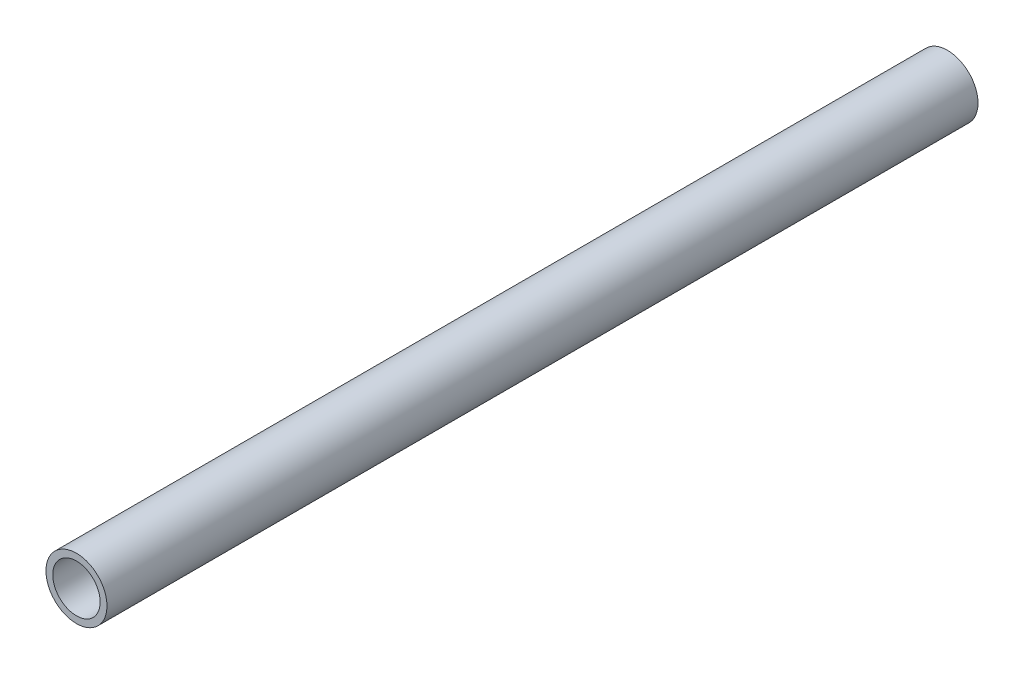
ISO-10303-21;
HEADER;
FILE_DESCRIPTION(('STEP AP214'),'2;1');
FILE_NAME('part.step','',(''),(''),'','','');
FILE_SCHEMA(('AUTOMOTIVE_DESIGN { 1 0 10303 214 1 1 1 1 }'));
ENDSEC;
DATA;
#1=APPLICATION_CONTEXT('core data for automotive mechanical design processes');
#2=APPLICATION_PROTOCOL_DEFINITION('international standard','automotive_design',2000,#1);
#3=PRODUCT_CONTEXT('',#1,'mechanical');
#4=PRODUCT('Part','Part','',(#3));
#5=PRODUCT_RELATED_PRODUCT_CATEGORY('part','',(#4));
#6=PRODUCT_DEFINITION_FORMATION('','',#4);
#7=PRODUCT_DEFINITION_CONTEXT('part definition',#1,'design');
#8=PRODUCT_DEFINITION('design','',#6,#7);
#9=PRODUCT_DEFINITION_SHAPE('','',#8);
#10=(LENGTH_UNIT() NAMED_UNIT(*) SI_UNIT(.MILLI.,.METRE.));
#11=(NAMED_UNIT(*) PLANE_ANGLE_UNIT() SI_UNIT($,.RADIAN.));
#12=(NAMED_UNIT(*) SI_UNIT($,.STERADIAN.) SOLID_ANGLE_UNIT());
#13=UNCERTAINTY_MEASURE_WITH_UNIT(LENGTH_MEASURE(1.E-05),#10,'distance_accuracy_value','');
#14=(GEOMETRIC_REPRESENTATION_CONTEXT(3) GLOBAL_UNCERTAINTY_ASSIGNED_CONTEXT((#13)) GLOBAL_UNIT_ASSIGNED_CONTEXT((#10,
#11,#12)) REPRESENTATION_CONTEXT('',''));
#15=CARTESIAN_POINT('',(0.,0.,0.));
#16=DIRECTION('',(0.,0.,1.));
#17=DIRECTION('',(1.,0.,0.));
#18=AXIS2_PLACEMENT_3D('',#15,#16,#17);
#19=CARTESIAN_POINT('',(0.,0.,257.));
#20=DIRECTION('',(0.,0.,1.));
#21=DIRECTION('',(1.,0.,0.));
#22=AXIS2_PLACEMENT_3D('',#19,#20,#21);
#23=PLANE('',#22);
#24=CARTESIAN_POINT('',(0.,0.,257.));
#25=DIRECTION('',(0.,0.,1.));
#26=DIRECTION('',(1.,0.,0.));
#27=AXIS2_PLACEMENT_3D('',#24,#25,#26);
#28=CIRCLE('',#27,9.);
#29=CARTESIAN_POINT('',(9.,0.,257.));
#30=VERTEX_POINT('',#29);
#31=EDGE_CURVE('E10',#30,#30,#28,.T.);
#32=ORIENTED_EDGE('',*,*,#31,.T.);
#33=EDGE_LOOP('',(#32));
#34=FACE_BOUND('',#33,.T.);
#35=CARTESIAN_POINT('',(0.,0.,257.));
#36=DIRECTION('',(0.,0.,1.));
#37=DIRECTION('',(1.,0.,0.));
#38=AXIS2_PLACEMENT_3D('',#35,#36,#37);
#39=CIRCLE('',#38,7.);
#40=CARTESIAN_POINT('',(7.,0.,257.));
#41=VERTEX_POINT('',#40);
#42=EDGE_CURVE('E41',#41,#41,#39,.T.);
#43=ORIENTED_EDGE('',*,*,#42,.F.);
#44=EDGE_LOOP('',(#43));
#45=FACE_BOUND('',#44,.T.);
#46=ADVANCED_FACE('F30',(#34,#45),#23,.T.);
#47=CARTESIAN_POINT('',(0.,0.,0.));
#48=DIRECTION('',(0.,0.,1.));
#49=DIRECTION('',(1.,0.,0.));
#50=AXIS2_PLACEMENT_3D('',#47,#48,#49);
#51=PLANE('',#50);
#52=CARTESIAN_POINT('',(0.,0.,0.));
#53=DIRECTION('',(0.,0.,1.));
#54=DIRECTION('',(1.,0.,0.));
#55=AXIS2_PLACEMENT_3D('',#52,#53,#54);
#56=CIRCLE('',#55,9.);
#57=CARTESIAN_POINT('',(9.,0.,0.));
#58=VERTEX_POINT('',#57);
#59=EDGE_CURVE('E34',#58,#58,#56,.T.);
#60=ORIENTED_EDGE('',*,*,#59,.F.);
#61=EDGE_LOOP('',(#60));
#62=FACE_BOUND('',#61,.T.);
#63=CARTESIAN_POINT('',(0.,0.,0.));
#64=DIRECTION('',(0.,0.,1.));
#65=DIRECTION('',(1.,0.,0.));
#66=AXIS2_PLACEMENT_3D('',#63,#64,#65);
#67=CIRCLE('',#66,7.);
#68=CARTESIAN_POINT('',(7.,0.,0.));
#69=VERTEX_POINT('',#68);
#70=EDGE_CURVE('E43',#69,#69,#67,.T.);
#71=ORIENTED_EDGE('',*,*,#70,.T.);
#72=EDGE_LOOP('',(#71));
#73=FACE_BOUND('',#72,.T.);
#74=ADVANCED_FACE('F53',(#62,#73),#51,.F.);
#75=CARTESIAN_POINT('',(0.,0.,257.));
#76=DIRECTION('',(0.,0.,-1.));
#77=DIRECTION('',(-1.,0.,0.));
#78=AXIS2_PLACEMENT_3D('',#75,#76,#77);
#79=CYLINDRICAL_SURFACE('',#78,9.);
#80=ORIENTED_EDGE('',*,*,#31,.F.);
#81=EDGE_LOOP('',(#80));
#82=FACE_BOUND('',#81,.T.);
#83=ORIENTED_EDGE('',*,*,#59,.T.);
#84=EDGE_LOOP('',(#83));
#85=FACE_BOUND('',#84,.T.);
#86=ADVANCED_FACE('F32',(#82,#85),#79,.T.);
#87=CARTESIAN_POINT('',(0.,0.,257.));
#88=DIRECTION('',(0.,0.,-1.));
#89=DIRECTION('',(-1.,0.,0.));
#90=AXIS2_PLACEMENT_3D('',#87,#88,#89);
#91=CYLINDRICAL_SURFACE('',#90,7.);
#92=ORIENTED_EDGE('',*,*,#42,.T.);
#93=EDGE_LOOP('',(#92));
#94=FACE_BOUND('',#93,.T.);
#95=ORIENTED_EDGE('',*,*,#70,.F.);
#96=EDGE_LOOP('',(#95));
#97=FACE_BOUND('',#96,.T.);
#98=ADVANCED_FACE('F49',(#94,#97),#91,.F.);
#99=CLOSED_SHELL('',(#46,#74,#86,#98));
#100=MANIFOLD_SOLID_BREP('B2',#99);
#101=ADVANCED_BREP_SHAPE_REPRESENTATION('',(#18,#100),#14);
#102=SHAPE_DEFINITION_REPRESENTATION(#9,#101);
ENDSEC;
END-ISO-10303-21;
